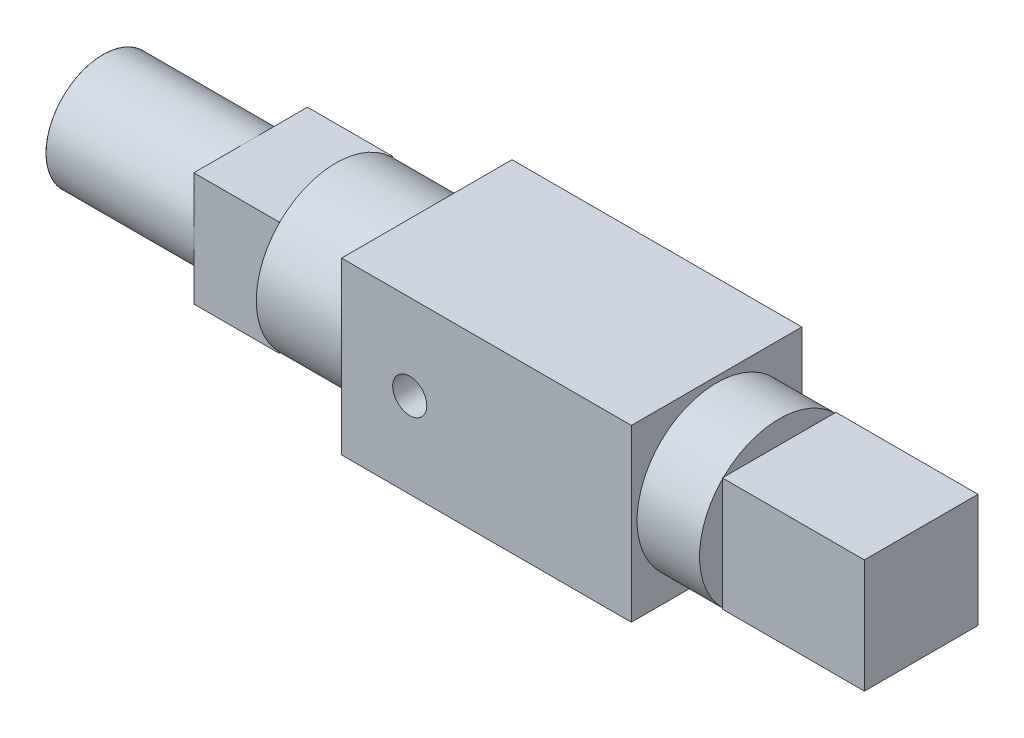
ISO-10303-21;
HEADER;
FILE_DESCRIPTION(('STEP AP214'),'2;1');
FILE_NAME('part.step','',(''),(''),'','','');
FILE_SCHEMA(('AUTOMOTIVE_DESIGN { 1 0 10303 214 1 1 1 1 }'));
ENDSEC;
DATA;
#1=APPLICATION_CONTEXT('core data for automotive mechanical design processes');
#2=APPLICATION_PROTOCOL_DEFINITION('international standard','automotive_design',2000,#1);
#3=PRODUCT_CONTEXT('',#1,'mechanical');
#4=PRODUCT('Part','Part','',(#3));
#5=PRODUCT_RELATED_PRODUCT_CATEGORY('part','',(#4));
#6=PRODUCT_DEFINITION_FORMATION('','',#4);
#7=PRODUCT_DEFINITION_CONTEXT('part definition',#1,'design');
#8=PRODUCT_DEFINITION('design','',#6,#7);
#9=PRODUCT_DEFINITION_SHAPE('','',#8);
#10=(LENGTH_UNIT() NAMED_UNIT(*) SI_UNIT(.MILLI.,.METRE.));
#11=(NAMED_UNIT(*) PLANE_ANGLE_UNIT() SI_UNIT($,.RADIAN.));
#12=(NAMED_UNIT(*) SI_UNIT($,.STERADIAN.) SOLID_ANGLE_UNIT());
#13=UNCERTAINTY_MEASURE_WITH_UNIT(LENGTH_MEASURE(1.E-05),#10,'distance_accuracy_value','');
#14=(GEOMETRIC_REPRESENTATION_CONTEXT(3) GLOBAL_UNCERTAINTY_ASSIGNED_CONTEXT((#13)) GLOBAL_UNIT_ASSIGNED_CONTEXT((#10,
#11,#12)) REPRESENTATION_CONTEXT('',''));
#15=CARTESIAN_POINT('',(0.,0.,0.));
#16=DIRECTION('',(0.,0.,1.));
#17=DIRECTION('',(1.,0.,0.));
#18=AXIS2_PLACEMENT_3D('',#15,#16,#17);
#19=CARTESIAN_POINT('',(72.,-7.49999999999999,-7.50000000000002));
#20=DIRECTION('',(0.,0.,1.00000000000001));
#21=DIRECTION('',(1.,0.,0.));
#22=AXIS2_PLACEMENT_3D('',#19,#20,#21);
#23=PLANE('',#22);
#24=CARTESIAN_POINT('',(34.5,0.,-7.49999999999999));
#25=DIRECTION('',(0.,0.,1.00000000000001));
#26=DIRECTION('',(1.,0.,0.));
#27=AXIS2_PLACEMENT_3D('',#24,#25,#26);
#28=CIRCLE('',#27,1.5);
#29=CARTESIAN_POINT('',(36.,0.,-7.49999999999999));
#30=VERTEX_POINT('',#29);
#31=EDGE_CURVE('E396',#30,#30,#28,.T.);
#32=ORIENTED_EDGE('',*,*,#31,.T.);
#33=EDGE_LOOP('',(#32));
#34=FACE_BOUND('',#33,.T.);
#35=DIRECTION('',(0.,1.00000000000001,0.));
#36=VECTOR('',#35,1.);
#37=CARTESIAN_POINT('',(54.,-7.49999999999999,-7.50000000000001));
#38=LINE('',#37,#36);
#39=CARTESIAN_POINT('',(54.,-7.49999999999999,-7.50000000000001));
#40=VERTEX_POINT('',#39);
#41=CARTESIAN_POINT('',(54.,7.50000000000002,-7.50000000000006));
#42=VERTEX_POINT('',#41);
#43=EDGE_CURVE('E191',#40,#42,#38,.T.);
#44=ORIENTED_EDGE('',*,*,#43,.F.);
#45=DIRECTION('',(-1.,0.,0.));
#46=VECTOR('',#45,1.);
#47=CARTESIAN_POINT('',(72.,-7.49999999999999,-7.50000000000002));
#48=LINE('',#47,#46);
#49=CARTESIAN_POINT('',(28.5,-7.49999999999999,-7.50000000000001));
#50=VERTEX_POINT('',#49);
#51=EDGE_CURVE('E201',#40,#50,#48,.T.);
#52=ORIENTED_EDGE('',*,*,#51,.T.);
#53=DIRECTION('',(0.,-1.00000000000001,0.));
#54=VECTOR('',#53,1.);
#55=CARTESIAN_POINT('',(28.5,7.50000000000001,-7.50000000000001));
#56=LINE('',#55,#54);
#57=CARTESIAN_POINT('',(28.5,7.50000000000001,-7.50000000000001));
#58=VERTEX_POINT('',#57);
#59=EDGE_CURVE('E240',#58,#50,#56,.T.);
#60=ORIENTED_EDGE('',*,*,#59,.F.);
#61=DIRECTION('',(-1.,0.,0.));
#62=VECTOR('',#61,1.);
#63=CARTESIAN_POINT('',(72.,7.50000000000002,-7.50000000000006));
#64=LINE('',#63,#62);
#65=EDGE_CURVE('E11',#42,#58,#64,.T.);
#66=ORIENTED_EDGE('',*,*,#65,.F.);
#67=EDGE_LOOP('',(#44,#52,#60,#66));
#68=FACE_BOUND('',#67,.T.);
#69=ADVANCED_FACE('F43',(#34,#68),#23,.F.);
#70=CARTESIAN_POINT('',(72.,7.50000000000001,7.49999999999999));
#71=DIRECTION('',(0.,-1.00000000000001,0.));
#72=DIRECTION('',(0.,0.,-1.00000000000001));
#73=AXIS2_PLACEMENT_3D('',#70,#71,#72);
#74=PLANE('',#73);
#75=DIRECTION('',(0.,0.,1.00000000000001));
#76=VECTOR('',#75,1.);
#77=CARTESIAN_POINT('',(54.,7.50000000000002,-7.50000000000006));
#78=LINE('',#77,#76);
#79=CARTESIAN_POINT('',(54.,7.50000000000001,7.49999999999999));
#80=VERTEX_POINT('',#79);
#81=EDGE_CURVE('E204',#42,#80,#78,.T.);
#82=ORIENTED_EDGE('',*,*,#81,.F.);
#83=ORIENTED_EDGE('',*,*,#65,.T.);
#84=DIRECTION('',(0.,0.,-1.00000000000001));
#85=VECTOR('',#84,1.);
#86=CARTESIAN_POINT('',(28.5,7.50000000000001,7.5));
#87=LINE('',#86,#85);
#88=CARTESIAN_POINT('',(28.5,7.50000000000001,7.5));
#89=VERTEX_POINT('',#88);
#90=EDGE_CURVE('E235',#89,#58,#87,.T.);
#91=ORIENTED_EDGE('',*,*,#90,.F.);
#92=DIRECTION('',(-1.,0.,0.));
#93=VECTOR('',#92,1.);
#94=CARTESIAN_POINT('',(72.,7.50000000000001,7.49999999999999));
#95=LINE('',#94,#93);
#96=EDGE_CURVE('E51',#80,#89,#95,.T.);
#97=ORIENTED_EDGE('',*,*,#96,.F.);
#98=EDGE_LOOP('',(#82,#83,#91,#97));
#99=FACE_BOUND('',#98,.T.);
#100=ADVANCED_FACE('F238',(#99),#74,.F.);
#101=CARTESIAN_POINT('',(72.,-7.49999999999997,7.50000000000003));
#102=DIRECTION('',(0.,0.,-1.00000000000001));
#103=DIRECTION('',(-1.,0.,0.));
#104=AXIS2_PLACEMENT_3D('',#101,#102,#103);
#105=PLANE('',#104);
#106=CARTESIAN_POINT('',(34.5,0.,7.50000000000011));
#107=DIRECTION('',(0.,0.,1.00000000000001));
#108=DIRECTION('',(1.,0.,0.));
#109=AXIS2_PLACEMENT_3D('',#106,#107,#108);
#110=CIRCLE('',#109,1.5);
#111=CARTESIAN_POINT('',(36.,0.,7.50000000000011));
#112=VERTEX_POINT('',#111);
#113=EDGE_CURVE('E400',#112,#112,#110,.T.);
#114=ORIENTED_EDGE('',*,*,#113,.F.);
#115=EDGE_LOOP('',(#114));
#116=FACE_BOUND('',#115,.T.);
#117=DIRECTION('',(0.,-1.00000000000001,0.));
#118=VECTOR('',#117,1.);
#119=CARTESIAN_POINT('',(54.,7.50000000000001,7.49999999999999));
#120=LINE('',#119,#118);
#121=CARTESIAN_POINT('',(54.,-7.49999999999999,7.5));
#122=VERTEX_POINT('',#121);
#123=EDGE_CURVE('E58',#80,#122,#120,.T.);
#124=ORIENTED_EDGE('',*,*,#123,.F.);
#125=ORIENTED_EDGE('',*,*,#96,.T.);
#126=DIRECTION('',(0.,1.00000000000001,0.));
#127=VECTOR('',#126,1.);
#128=CARTESIAN_POINT('',(28.5,-7.49999999999999,7.5));
#129=LINE('',#128,#127);
#130=CARTESIAN_POINT('',(28.5,-7.49999999999999,7.5));
#131=VERTEX_POINT('',#130);
#132=EDGE_CURVE('E229',#131,#89,#129,.T.);
#133=ORIENTED_EDGE('',*,*,#132,.F.);
#134=DIRECTION('',(-1.,0.,0.));
#135=VECTOR('',#134,1.);
#136=CARTESIAN_POINT('',(72.,-7.49999999999997,7.50000000000003));
#137=LINE('',#136,#135);
#138=EDGE_CURVE('E211',#122,#131,#137,.T.);
#139=ORIENTED_EDGE('',*,*,#138,.F.);
#140=EDGE_LOOP('',(#124,#125,#133,#139));
#141=FACE_BOUND('',#140,.T.);
#142=ADVANCED_FACE('F228',(#116,#141),#105,.F.);
#143=CARTESIAN_POINT('',(72.,-7.49999999999997,7.50000000000003));
#144=DIRECTION('',(0.,1.00000000000001,0.));
#145=DIRECTION('',(0.,0.,1.00000000000001));
#146=AXIS2_PLACEMENT_3D('',#143,#144,#145);
#147=PLANE('',#146);
#148=DIRECTION('',(0.,0.,-1.00000000000001));
#149=VECTOR('',#148,1.);
#150=CARTESIAN_POINT('',(54.,-7.49999999999999,7.5));
#151=LINE('',#150,#149);
#152=EDGE_CURVE('E188',#122,#40,#151,.T.);
#153=ORIENTED_EDGE('',*,*,#152,.F.);
#154=ORIENTED_EDGE('',*,*,#138,.T.);
#155=DIRECTION('',(0.,0.,1.00000000000001));
#156=VECTOR('',#155,1.);
#157=CARTESIAN_POINT('',(28.5,-7.49999999999999,-7.50000000000001));
#158=LINE('',#157,#156);
#159=EDGE_CURVE('E209',#50,#131,#158,.T.);
#160=ORIENTED_EDGE('',*,*,#159,.F.);
#161=ORIENTED_EDGE('',*,*,#51,.F.);
#162=EDGE_LOOP('',(#153,#154,#160,#161));
#163=FACE_BOUND('',#162,.T.);
#164=ADVANCED_FACE('F207',(#163),#147,.F.);
#165=CARTESIAN_POINT('',(20.5,0.,0.));
#166=DIRECTION('',(-1.,0.,0.));
#167=DIRECTION('',(0.,0.,1.00000000000001));
#168=AXIS2_PLACEMENT_3D('',#165,#166,#167);
#169=PLANE('',#168);
#170=DIRECTION('',(0.,0.,-1.00000000000001));
#171=VECTOR('',#170,1.);
#172=CARTESIAN_POINT('',(20.5,5.00000000000005,-5.00000000000001));
#173=LINE('',#172,#171);
#174=CARTESIAN_POINT('',(20.5,5.,4.89897948556636));
#175=VERTEX_POINT('',#174);
#176=CARTESIAN_POINT('',(20.5,5.,-4.89897948556637));
#177=VERTEX_POINT('',#176);
#178=EDGE_CURVE('E263',#175,#177,#173,.T.);
#179=ORIENTED_EDGE('',*,*,#178,.F.);
#180=CARTESIAN_POINT('',(20.5,0.,0.));
#181=DIRECTION('',(-1.,0.,0.));
#182=DIRECTION('',(0.,0.,1.00000000000001));
#183=AXIS2_PLACEMENT_3D('',#180,#181,#182);
#184=CIRCLE('',#183,7.);
#185=EDGE_CURVE('E366',#175,#177,#184,.T.);
#186=ORIENTED_EDGE('',*,*,#185,.T.);
#187=EDGE_LOOP('',(#179,#186));
#188=FACE_BOUND('',#187,.T.);
#189=ADVANCED_FACE('F550',(#188),#169,.T.);
#190=DIRECTION('',(0.,-1.00000000000001,0.));
#191=VECTOR('',#190,1.);
#192=CARTESIAN_POINT('',(20.5,-4.99999999999999,-5.00000000000003));
#193=LINE('',#192,#191);
#194=CARTESIAN_POINT('',(20.5,4.89897948556635,-5.));
#195=VERTEX_POINT('',#194);
#196=CARTESIAN_POINT('',(20.5,-4.89897948556629,-4.99999999999998));
#197=VERTEX_POINT('',#196);
#198=EDGE_CURVE('E269',#195,#197,#193,.T.);
#199=ORIENTED_EDGE('',*,*,#198,.F.);
#200=EDGE_CURVE('E359',#195,#197,#184,.T.);
#201=ORIENTED_EDGE('',*,*,#200,.T.);
#202=EDGE_LOOP('',(#199,#201));
#203=FACE_BOUND('',#202,.T.);
#204=ADVANCED_FACE('F568',(#203),#169,.T.);
#205=DIRECTION('',(0.,0.,1.00000000000001));
#206=VECTOR('',#205,1.);
#207=CARTESIAN_POINT('',(20.5,-4.99999999999999,-5.00000000000003));
#208=LINE('',#207,#206);
#209=CARTESIAN_POINT('',(20.5,-4.99999999999996,-4.89897948556636));
#210=VERTEX_POINT('',#209);
#211=CARTESIAN_POINT('',(20.5,-5.,4.89897948556637));
#212=VERTEX_POINT('',#211);
#213=EDGE_CURVE('E274',#210,#212,#208,.T.);
#214=ORIENTED_EDGE('',*,*,#213,.F.);
#215=EDGE_CURVE('E348',#210,#212,#184,.T.);
#216=ORIENTED_EDGE('',*,*,#215,.T.);
#217=EDGE_LOOP('',(#214,#216));
#218=FACE_BOUND('',#217,.T.);
#219=ADVANCED_FACE('F347',(#218),#169,.T.);
#220=DIRECTION('',(0.,1.00000000000001,0.));
#221=VECTOR('',#220,1.);
#222=CARTESIAN_POINT('',(20.5,-4.99999999999996,5.00000000000004));
#223=LINE('',#222,#221);
#224=CARTESIAN_POINT('',(20.5,-4.89897948556636,4.99999999999999));
#225=VERTEX_POINT('',#224);
#226=CARTESIAN_POINT('',(20.5,4.89897948556642,5.00000000000002));
#227=VERTEX_POINT('',#226);
#228=EDGE_CURVE('E264',#225,#227,#223,.T.);
#229=ORIENTED_EDGE('',*,*,#228,.F.);
#230=EDGE_CURVE('E361',#225,#227,#184,.T.);
#231=ORIENTED_EDGE('',*,*,#230,.T.);
#232=EDGE_LOOP('',(#229,#231));
#233=FACE_BOUND('',#232,.T.);
#234=ADVANCED_FACE('F487',(#233),#169,.T.);
#235=CARTESIAN_POINT('',(13.,0.,0.));
#236=DIRECTION('',(-1.,0.,0.));
#237=DIRECTION('',(0.,0.,1.00000000000001));
#238=AXIS2_PLACEMENT_3D('',#235,#236,#237);
#239=PLANE('',#238);
#240=DIRECTION('',(0.,-1.00000000000001,0.));
#241=VECTOR('',#240,1.);
#242=CARTESIAN_POINT('',(13.,-4.99999999999991,-5.00000000000012));
#243=LINE('',#242,#241);
#244=CARTESIAN_POINT('',(13.,0.,-5.));
#245=VERTEX_POINT('',#244);
#246=CARTESIAN_POINT('',(13.,-4.99999999999991,-5.00000000000012));
#247=VERTEX_POINT('',#246);
#248=EDGE_CURVE('E289',#245,#247,#243,.T.);
#249=ORIENTED_EDGE('',*,*,#248,.T.);
#250=DIRECTION('',(0.,0.,1.00000000000001));
#251=VECTOR('',#250,1.);
#252=CARTESIAN_POINT('',(13.,-4.99999999999991,-5.00000000000012));
#253=LINE('',#252,#251);
#254=CARTESIAN_POINT('',(13.,-5.00000000000002,0.));
#255=VERTEX_POINT('',#254);
#256=EDGE_CURVE('E295',#247,#255,#253,.T.);
#257=ORIENTED_EDGE('',*,*,#256,.T.);
#258=CARTESIAN_POINT('',(13.,0.,0.));
#259=DIRECTION('',(-1.,0.,0.));
#260=DIRECTION('',(0.,0.,1.00000000000001));
#261=AXIS2_PLACEMENT_3D('',#258,#259,#260);
#262=CIRCLE('',#261,5.);
#263=EDGE_CURVE('E805',#245,#255,#262,.T.);
#264=ORIENTED_EDGE('',*,*,#263,.F.);
#265=EDGE_LOOP('',(#249,#257,#264));
#266=FACE_BOUND('',#265,.T.);
#267=ADVANCED_FACE('F556',(#266),#239,.T.);
#268=CARTESIAN_POINT('',(13.,0.,5.));
#269=VERTEX_POINT('',#268);
#270=EDGE_CURVE('E220',#255,#269,#262,.T.);
#271=ORIENTED_EDGE('',*,*,#270,.F.);
#272=CARTESIAN_POINT('',(13.,-4.99999999999999,5.));
#273=VERTEX_POINT('',#272);
#274=EDGE_CURVE('E294',#255,#273,#253,.T.);
#275=ORIENTED_EDGE('',*,*,#274,.T.);
#276=DIRECTION('',(0.,1.00000000000001,0.));
#277=VECTOR('',#276,1.);
#278=CARTESIAN_POINT('',(13.,-4.99999999999999,5.));
#279=LINE('',#278,#277);
#280=EDGE_CURVE('E280',#273,#269,#279,.T.);
#281=ORIENTED_EDGE('',*,*,#280,.T.);
#282=EDGE_LOOP('',(#271,#275,#281));
#283=FACE_BOUND('',#282,.T.);
#284=ADVANCED_FACE('F559',(#283),#239,.T.);
#285=CARTESIAN_POINT('',(13.,5.00000000000005,0.));
#286=VERTEX_POINT('',#285);
#287=EDGE_CURVE('E212',#269,#286,#262,.T.);
#288=ORIENTED_EDGE('',*,*,#287,.F.);
#289=CARTESIAN_POINT('',(13.,4.99999999999999,5.00000000000001));
#290=VERTEX_POINT('',#289);
#291=EDGE_CURVE('E258',#269,#290,#279,.T.);
#292=ORIENTED_EDGE('',*,*,#291,.T.);
#293=DIRECTION('',(0.,0.,-1.00000000000001));
#294=VECTOR('',#293,1.);
#295=CARTESIAN_POINT('',(13.0000000000002,5.00000000000003,-5.));
#296=LINE('',#295,#294);
#297=EDGE_CURVE('E285',#290,#286,#296,.T.);
#298=ORIENTED_EDGE('',*,*,#297,.T.);
#299=EDGE_LOOP('',(#288,#292,#298));
#300=FACE_BOUND('',#299,.T.);
#301=ADVANCED_FACE('F324',(#300),#239,.T.);
#302=CARTESIAN_POINT('',(13.0000000000002,5.00000000000003,-5.));
#303=VERTEX_POINT('',#302);
#304=EDGE_CURVE('E284',#286,#303,#296,.T.);
#305=ORIENTED_EDGE('',*,*,#304,.T.);
#306=EDGE_CURVE('E290',#303,#245,#243,.T.);
#307=ORIENTED_EDGE('',*,*,#306,.T.);
#308=EDGE_CURVE('E218',#286,#245,#262,.T.);
#309=ORIENTED_EDGE('',*,*,#308,.F.);
#310=EDGE_LOOP('',(#305,#307,#309));
#311=FACE_BOUND('',#310,.T.);
#312=ADVANCED_FACE('F561',(#311),#239,.T.);
#313=CARTESIAN_POINT('',(13.,0.,0.));
#314=DIRECTION('',(-1.,0.,0.));
#315=DIRECTION('',(0.,0.,1.00000000000001));
#316=AXIS2_PLACEMENT_3D('',#313,#314,#315);
#317=CYLINDRICAL_SURFACE('',#316,5.);
#318=ORIENTED_EDGE('',*,*,#287,.T.);
#319=ORIENTED_EDGE('',*,*,#308,.T.);
#320=ORIENTED_EDGE('',*,*,#263,.T.);
#321=ORIENTED_EDGE('',*,*,#270,.T.);
#322=EDGE_LOOP('',(#318,#319,#320,#321));
#323=FACE_BOUND('',#322,.T.);
#324=CARTESIAN_POINT('',(0.,0.,0.));
#325=DIRECTION('',(-1.,0.,0.));
#326=DIRECTION('',(0.,0.,1.00000000000001));
#327=AXIS2_PLACEMENT_3D('',#324,#325,#326);
#328=CIRCLE('',#327,5.);
#329=CARTESIAN_POINT('',(0.,0.,5.00000000000003));
#330=VERTEX_POINT('',#329);
#331=EDGE_CURVE('E222',#330,#330,#328,.T.);
#332=ORIENTED_EDGE('',*,*,#331,.F.);
#333=EDGE_LOOP('',(#332));
#334=FACE_BOUND('',#333,.T.);
#335=ADVANCED_FACE('F562',(#323,#334),#317,.T.);
#336=CARTESIAN_POINT('',(20.5,-4.99999999999996,5.00000000000004));
#337=DIRECTION('',(0.,0.,1.00000000000001));
#338=DIRECTION('',(1.,0.,0.));
#339=AXIS2_PLACEMENT_3D('',#336,#337,#338);
#340=PLANE('',#339);
#341=ORIENTED_EDGE('',*,*,#280,.F.);
#342=DIRECTION('',(-1.,0.,0.));
#343=VECTOR('',#342,1.);
#344=CARTESIAN_POINT('',(20.5,-4.99999999999996,5.00000000000004));
#345=LINE('',#344,#343);
#346=CARTESIAN_POINT('',(20.5,-4.99999999999996,5.00000000000004));
#347=VERTEX_POINT('',#346);
#348=EDGE_CURVE('E299',#347,#273,#345,.T.);
#349=ORIENTED_EDGE('',*,*,#348,.F.);
#350=EDGE_CURVE('E259',#347,#225,#223,.T.);
#351=ORIENTED_EDGE('',*,*,#350,.T.);
#352=ORIENTED_EDGE('',*,*,#228,.T.);
#353=DIRECTION('',(0.,-1.00000000000001,0.));
#354=VECTOR('',#353,1.);
#355=CARTESIAN_POINT('',(20.5,-4.99999999999996,5.00000000000004));
#356=LINE('',#355,#354);
#357=CARTESIAN_POINT('',(20.5,5.,5.00000000000002));
#358=VERTEX_POINT('',#357);
#359=EDGE_CURVE('E243',#358,#227,#356,.T.);
#360=ORIENTED_EDGE('',*,*,#359,.F.);
#361=DIRECTION('',(-1.,0.,0.));
#362=VECTOR('',#361,1.);
#363=CARTESIAN_POINT('',(20.5,5.,5.00000000000002));
#364=LINE('',#363,#362);
#365=EDGE_CURVE('E279',#358,#290,#364,.T.);
#366=ORIENTED_EDGE('',*,*,#365,.T.);
#367=ORIENTED_EDGE('',*,*,#291,.F.);
#368=EDGE_LOOP('',(#341,#349,#351,#352,#360,#366,#367));
#369=FACE_BOUND('',#368,.T.);
#370=ADVANCED_FACE('F315',(#369),#340,.T.);
#371=CARTESIAN_POINT('',(20.5,-4.99999999999999,-5.00000000000003));
#372=DIRECTION('',(0.,-1.00000000000001,0.));
#373=DIRECTION('',(0.,0.,-1.00000000000001));
#374=AXIS2_PLACEMENT_3D('',#371,#372,#373);
#375=PLANE('',#374);
#376=ORIENTED_EDGE('',*,*,#256,.F.);
#377=DIRECTION('',(-1.,0.,0.));
#378=VECTOR('',#377,1.);
#379=CARTESIAN_POINT('',(20.5,-4.99999999999999,-5.00000000000003));
#380=LINE('',#379,#378);
#381=CARTESIAN_POINT('',(20.5,-4.99999999999999,-5.00000000000003));
#382=VERTEX_POINT('',#381);
#383=EDGE_CURVE('E302',#382,#247,#380,.T.);
#384=ORIENTED_EDGE('',*,*,#383,.F.);
#385=EDGE_CURVE('E275',#382,#210,#208,.T.);
#386=ORIENTED_EDGE('',*,*,#385,.T.);
#387=ORIENTED_EDGE('',*,*,#213,.T.);
#388=DIRECTION('',(0.,0.,-1.00000000000001));
#389=VECTOR('',#388,1.);
#390=CARTESIAN_POINT('',(20.5,-4.99999999999999,-5.00000000000003));
#391=LINE('',#390,#389);
#392=EDGE_CURVE('E255',#347,#212,#391,.T.);
#393=ORIENTED_EDGE('',*,*,#392,.F.);
#394=ORIENTED_EDGE('',*,*,#348,.T.);
#395=ORIENTED_EDGE('',*,*,#274,.F.);
#396=EDGE_LOOP('',(#376,#384,#386,#387,#393,#394,#395));
#397=FACE_BOUND('',#396,.T.);
#398=ADVANCED_FACE('F342',(#397),#375,.T.);
#399=CARTESIAN_POINT('',(20.5,-4.99999999999999,-5.00000000000003));
#400=DIRECTION('',(0.,0.,-1.00000000000001));
#401=DIRECTION('',(-1.,0.,0.));
#402=AXIS2_PLACEMENT_3D('',#399,#400,#401);
#403=PLANE('',#402);
#404=ORIENTED_EDGE('',*,*,#306,.F.);
#405=DIRECTION('',(-1.,0.,0.));
#406=VECTOR('',#405,1.);
#407=CARTESIAN_POINT('',(20.5,5.00000000000005,-5.00000000000001));
#408=LINE('',#407,#406);
#409=CARTESIAN_POINT('',(20.5,5.00000000000005,-5.00000000000001));
#410=VERTEX_POINT('',#409);
#411=EDGE_CURVE('E305',#410,#303,#408,.T.);
#412=ORIENTED_EDGE('',*,*,#411,.F.);
#413=EDGE_CURVE('E270',#410,#195,#193,.T.);
#414=ORIENTED_EDGE('',*,*,#413,.T.);
#415=ORIENTED_EDGE('',*,*,#198,.T.);
#416=DIRECTION('',(0.,1.00000000000001,0.));
#417=VECTOR('',#416,1.);
#418=CARTESIAN_POINT('',(20.5,-4.99999999999999,-5.00000000000003));
#419=LINE('',#418,#417);
#420=EDGE_CURVE('E250',#382,#197,#419,.T.);
#421=ORIENTED_EDGE('',*,*,#420,.F.);
#422=ORIENTED_EDGE('',*,*,#383,.T.);
#423=ORIENTED_EDGE('',*,*,#248,.F.);
#424=EDGE_LOOP('',(#404,#412,#414,#415,#421,#422,#423));
#425=FACE_BOUND('',#424,.T.);
#426=ADVANCED_FACE('F574',(#425),#403,.T.);
#427=CARTESIAN_POINT('',(20.5,5.00000000000005,-5.00000000000001));
#428=DIRECTION('',(0.,1.00000000000001,0.));
#429=DIRECTION('',(0.,0.,1.00000000000001));
#430=AXIS2_PLACEMENT_3D('',#427,#428,#429);
#431=PLANE('',#430);
#432=ORIENTED_EDGE('',*,*,#297,.F.);
#433=ORIENTED_EDGE('',*,*,#365,.F.);
#434=EDGE_CURVE('E265',#358,#175,#173,.T.);
#435=ORIENTED_EDGE('',*,*,#434,.T.);
#436=ORIENTED_EDGE('',*,*,#178,.T.);
#437=DIRECTION('',(0.,0.,1.00000000000001));
#438=VECTOR('',#437,1.);
#439=CARTESIAN_POINT('',(20.5,5.00000000000005,-5.00000000000001));
#440=LINE('',#439,#438);
#441=EDGE_CURVE('E247',#410,#177,#440,.T.);
#442=ORIENTED_EDGE('',*,*,#441,.F.);
#443=ORIENTED_EDGE('',*,*,#411,.T.);
#444=ORIENTED_EDGE('',*,*,#304,.F.);
#445=EDGE_LOOP('',(#432,#433,#435,#436,#442,#443,#444));
#446=FACE_BOUND('',#445,.T.);
#447=ADVANCED_FACE('F319',(#446),#431,.T.);
#448=CARTESIAN_POINT('',(20.5,0.,0.));
#449=DIRECTION('',(-1.,0.,0.));
#450=DIRECTION('',(0.,0.,1.00000000000001));
#451=AXIS2_PLACEMENT_3D('',#448,#449,#450);
#452=PLANE('',#451);
#453=ORIENTED_EDGE('',*,*,#350,.F.);
#454=ORIENTED_EDGE('',*,*,#392,.T.);
#455=EDGE_CURVE('E355',#212,#225,#184,.T.);
#456=ORIENTED_EDGE('',*,*,#455,.T.);
#457=EDGE_LOOP('',(#453,#454,#456));
#458=FACE_BOUND('',#457,.T.);
#459=ADVANCED_FACE('F385',(#458),#452,.F.);
#460=ORIENTED_EDGE('',*,*,#385,.F.);
#461=ORIENTED_EDGE('',*,*,#420,.T.);
#462=EDGE_CURVE('E354',#197,#210,#184,.T.);
#463=ORIENTED_EDGE('',*,*,#462,.T.);
#464=EDGE_LOOP('',(#460,#461,#463));
#465=FACE_BOUND('',#464,.T.);
#466=ADVANCED_FACE('F386',(#465),#452,.F.);
#467=ORIENTED_EDGE('',*,*,#413,.F.);
#468=ORIENTED_EDGE('',*,*,#441,.T.);
#469=EDGE_CURVE('E821',#177,#195,#184,.T.);
#470=ORIENTED_EDGE('',*,*,#469,.T.);
#471=EDGE_LOOP('',(#467,#468,#470));
#472=FACE_BOUND('',#471,.T.);
#473=ADVANCED_FACE('F377',(#472),#452,.F.);
#474=CARTESIAN_POINT('',(28.5,0.,0.));
#475=DIRECTION('',(-1.,0.,0.));
#476=DIRECTION('',(0.,0.,1.00000000000001));
#477=AXIS2_PLACEMENT_3D('',#474,#475,#476);
#478=PLANE('',#477);
#479=CARTESIAN_POINT('',(28.5,0.,0.));
#480=DIRECTION('',(-1.,0.,0.));
#481=DIRECTION('',(0.,0.,1.00000000000001));
#482=AXIS2_PLACEMENT_3D('',#479,#480,#481);
#483=CIRCLE('',#482,7.);
#484=CARTESIAN_POINT('',(28.5,0.,7.00000000000004));
#485=VERTEX_POINT('',#484);
#486=EDGE_CURVE('E365',#485,#485,#483,.T.);
#487=ORIENTED_EDGE('',*,*,#486,.F.);
#488=EDGE_LOOP('',(#487));
#489=FACE_BOUND('',#488,.T.);
#490=ORIENTED_EDGE('',*,*,#159,.T.);
#491=ORIENTED_EDGE('',*,*,#132,.T.);
#492=ORIENTED_EDGE('',*,*,#90,.T.);
#493=ORIENTED_EDGE('',*,*,#59,.T.);
#494=EDGE_LOOP('',(#490,#491,#492,#493));
#495=FACE_BOUND('',#494,.T.);
#496=ADVANCED_FACE('F234',(#489,#495),#478,.T.);
#497=ORIENTED_EDGE('',*,*,#359,.T.);
#498=EDGE_CURVE('E362',#227,#175,#184,.T.);
#499=ORIENTED_EDGE('',*,*,#498,.T.);
#500=ORIENTED_EDGE('',*,*,#434,.F.);
#501=EDGE_LOOP('',(#497,#499,#500));
#502=FACE_BOUND('',#501,.T.);
#503=ADVANCED_FACE('F376',(#502),#452,.F.);
#504=CARTESIAN_POINT('',(28.5,0.,0.));
#505=DIRECTION('',(-1.,0.,0.));
#506=DIRECTION('',(0.,0.,1.00000000000001));
#507=AXIS2_PLACEMENT_3D('',#504,#505,#506);
#508=CYLINDRICAL_SURFACE('',#507,7.);
#509=ORIENTED_EDGE('',*,*,#486,.T.);
#510=EDGE_LOOP('',(#509));
#511=FACE_BOUND('',#510,.T.);
#512=ORIENTED_EDGE('',*,*,#498,.F.);
#513=ORIENTED_EDGE('',*,*,#230,.F.);
#514=ORIENTED_EDGE('',*,*,#455,.F.);
#515=ORIENTED_EDGE('',*,*,#215,.F.);
#516=ORIENTED_EDGE('',*,*,#462,.F.);
#517=ORIENTED_EDGE('',*,*,#200,.F.);
#518=ORIENTED_EDGE('',*,*,#469,.F.);
#519=ORIENTED_EDGE('',*,*,#185,.F.);
#520=EDGE_LOOP('',(#512,#513,#514,#515,#516,#517,#518,#519));
#521=FACE_BOUND('',#520,.T.);
#522=ADVANCED_FACE('F373',(#511,#521),#508,.T.);
#523=CARTESIAN_POINT('',(0.,0.,0.));
#524=DIRECTION('',(-1.,0.,0.));
#525=DIRECTION('',(0.,-1.00000000000001,0.));
#526=AXIS2_PLACEMENT_3D('',#523,#524,#525);
#527=PLANE('',#526);
#528=ORIENTED_EDGE('',*,*,#331,.T.);
#529=EDGE_LOOP('',(#528));
#530=FACE_BOUND('',#529,.T.);
#531=CARTESIAN_POINT('',(0.,0.,0.));
#532=DIRECTION('',(1.,0.,0.));
#533=DIRECTION('',(0.,1.00000000000001,0.));
#534=AXIS2_PLACEMENT_3D('',#531,#532,#533);
#535=CIRCLE('',#534,5.00899191454728);
#536=CARTESIAN_POINT('',(0.,5.0089919145473,0.));
#537=VERTEX_POINT('',#536);
#538=EDGE_CURVE('E470',#537,#537,#535,.T.);
#539=ORIENTED_EDGE('',*,*,#538,.T.);
#540=EDGE_LOOP('',(#539));
#541=FACE_BOUND('',#540,.T.);
#542=ADVANCED_FACE('F492',(#530,#541),#527,.F.);
#543=CARTESIAN_POINT('',(9.00000000000021,0.,0.));
#544=DIRECTION('',(1.,0.,0.));
#545=DIRECTION('',(0.,1.00000000000001,0.));
#546=AXIS2_PLACEMENT_3D('',#543,#544,#545);
#547=SPHERICAL_SURFACE('',#546,10.3);
#548=ORIENTED_EDGE('',*,*,#538,.F.);
#549=EDGE_LOOP('',(#548));
#550=FACE_BOUND('',#549,.T.);
#551=ADVANCED_FACE('F496',(#550),#547,.T.);
#552=CARTESIAN_POINT('',(59.5,0.,1.04083408558608E-13));
#553=DIRECTION('',(1.,0.,0.));
#554=DIRECTION('',(0.,0.,-1.00000000000001));
#555=AXIS2_PLACEMENT_3D('',#552,#553,#554);
#556=PLANE('',#555);
#557=DIRECTION('',(0.,1.00000000000001,0.));
#558=VECTOR('',#557,1.);
#559=CARTESIAN_POINT('',(59.5,-4.99999999999999,-4.99999999999996));
#560=LINE('',#559,#558);
#561=CARTESIAN_POINT('',(59.5,-4.99999999999999,-4.99999999999996));
#562=VERTEX_POINT('',#561);
#563=CARTESIAN_POINT('',(59.5,-4.89897948556636,-5.00000000000002));
#564=VERTEX_POINT('',#563);
#565=EDGE_CURVE('E430',#562,#564,#560,.T.);
#566=ORIENTED_EDGE('',*,*,#565,.F.);
#567=DIRECTION('',(0.,0.,1.00000000000001));
#568=VECTOR('',#567,1.);
#569=CARTESIAN_POINT('',(59.5,-4.99999999999998,5.00000000000002));
#570=LINE('',#569,#568);
#571=CARTESIAN_POINT('',(59.5,-4.99999999999999,-4.89897948556636));
#572=VERTEX_POINT('',#571);
#573=EDGE_CURVE('E426',#562,#572,#570,.T.);
#574=ORIENTED_EDGE('',*,*,#573,.T.);
#575=CARTESIAN_POINT('',(59.5,0.,1.04083408558608E-13));
#576=DIRECTION('',(1.,0.,0.));
#577=DIRECTION('',(0.,0.,-1.00000000000001));
#578=AXIS2_PLACEMENT_3D('',#575,#576,#577);
#579=CIRCLE('',#578,7.);
#580=EDGE_CURVE('E405',#572,#564,#579,.T.);
#581=ORIENTED_EDGE('',*,*,#580,.T.);
#582=EDGE_LOOP('',(#566,#574,#581));
#583=FACE_BOUND('',#582,.T.);
#584=ADVANCED_FACE('F502',(#583),#556,.F.);
#585=DIRECTION('',(0.,0.,-1.00000000000001));
#586=VECTOR('',#585,1.);
#587=CARTESIAN_POINT('',(59.5,-4.99999999999998,5.00000000000002));
#588=LINE('',#587,#586);
#589=CARTESIAN_POINT('',(59.5,-4.99999999999998,5.00000000000002));
#590=VERTEX_POINT('',#589);
#591=CARTESIAN_POINT('',(59.5,-4.99999999999999,4.89897948556636));
#592=VERTEX_POINT('',#591);
#593=EDGE_CURVE('E447',#590,#592,#588,.T.);
#594=ORIENTED_EDGE('',*,*,#593,.F.);
#595=DIRECTION('',(0.,1.00000000000001,0.));
#596=VECTOR('',#595,1.);
#597=CARTESIAN_POINT('',(59.5,-4.99999999999998,5.00000000000002));
#598=LINE('',#597,#596);
#599=CARTESIAN_POINT('',(59.5,-4.89897948556642,5.00000000000016));
#600=VERTEX_POINT('',#599);
#601=EDGE_CURVE('E423',#590,#600,#598,.T.);
#602=ORIENTED_EDGE('',*,*,#601,.T.);
#603=EDGE_CURVE('E752',#600,#592,#579,.T.);
#604=ORIENTED_EDGE('',*,*,#603,.T.);
#605=EDGE_LOOP('',(#594,#602,#604));
#606=FACE_BOUND('',#605,.T.);
#607=ADVANCED_FACE('F686',(#606),#556,.F.);
#608=DIRECTION('',(0.,-1.00000000000001,0.));
#609=VECTOR('',#608,1.);
#610=CARTESIAN_POINT('',(59.5,-4.99999999999998,5.00000000000002));
#611=LINE('',#610,#609);
#612=CARTESIAN_POINT('',(59.5,5.,5.00000000000001));
#613=VERTEX_POINT('',#612);
#614=CARTESIAN_POINT('',(59.5,4.89897948556642,5.00000000000002));
#615=VERTEX_POINT('',#614);
#616=EDGE_CURVE('E442',#613,#615,#611,.T.);
#617=ORIENTED_EDGE('',*,*,#616,.F.);
#618=DIRECTION('',(0.,0.,1.00000000000001));
#619=VECTOR('',#618,1.);
#620=CARTESIAN_POINT('',(59.5,5.,5.00000000000001));
#621=LINE('',#620,#619);
#622=CARTESIAN_POINT('',(59.5,4.99999999999999,4.89897948556637));
#623=VERTEX_POINT('',#622);
#624=EDGE_CURVE('E434',#623,#613,#621,.T.);
#625=ORIENTED_EDGE('',*,*,#624,.F.);
#626=EDGE_CURVE('E717',#623,#615,#579,.T.);
#627=ORIENTED_EDGE('',*,*,#626,.T.);
#628=EDGE_LOOP('',(#617,#625,#627));
#629=FACE_BOUND('',#628,.T.);
#630=ADVANCED_FACE('F532',(#629),#556,.F.);
#631=CARTESIAN_POINT('',(54.,0.,0.));
#632=DIRECTION('',(1.,0.,0.));
#633=DIRECTION('',(0.,0.,-1.00000000000001));
#634=AXIS2_PLACEMENT_3D('',#631,#632,#633);
#635=PLANE('',#634);
#636=CARTESIAN_POINT('',(54.,0.,0.));
#637=DIRECTION('',(1.,0.,0.));
#638=DIRECTION('',(0.,0.,-1.00000000000001));
#639=AXIS2_PLACEMENT_3D('',#636,#637,#638);
#640=CIRCLE('',#639,7.);
#641=CARTESIAN_POINT('',(54.,0.,-7.00000000000004));
#642=VERTEX_POINT('',#641);
#643=EDGE_CURVE('E410',#642,#642,#640,.T.);
#644=ORIENTED_EDGE('',*,*,#643,.F.);
#645=EDGE_LOOP('',(#644));
#646=FACE_BOUND('',#645,.T.);
#647=ORIENTED_EDGE('',*,*,#123,.T.);
#648=ORIENTED_EDGE('',*,*,#152,.T.);
#649=ORIENTED_EDGE('',*,*,#43,.T.);
#650=ORIENTED_EDGE('',*,*,#81,.T.);
#651=EDGE_LOOP('',(#647,#648,#649,#650));
#652=FACE_BOUND('',#651,.T.);
#653=ADVANCED_FACE('F190',(#646,#652),#635,.T.);
#654=DIRECTION('',(0.,-1.00000000000001,0.));
#655=VECTOR('',#654,1.);
#656=CARTESIAN_POINT('',(59.5,-4.99999999999999,-4.99999999999996));
#657=LINE('',#656,#655);
#658=CARTESIAN_POINT('',(59.5,5.00000000000005,-5.00000000000004));
#659=VERTEX_POINT('',#658);
#660=CARTESIAN_POINT('',(59.5,4.89897948556646,-5.00000000000002));
#661=VERTEX_POINT('',#660);
#662=EDGE_CURVE('E420',#659,#661,#657,.T.);
#663=ORIENTED_EDGE('',*,*,#662,.T.);
#664=CARTESIAN_POINT('',(59.5,5.00000000000012,-4.89897948556644));
#665=VERTEX_POINT('',#664);
#666=EDGE_CURVE('E66',#661,#665,#579,.T.);
#667=ORIENTED_EDGE('',*,*,#666,.T.);
#668=EDGE_CURVE('E436',#659,#665,#621,.T.);
#669=ORIENTED_EDGE('',*,*,#668,.F.);
#670=EDGE_LOOP('',(#663,#667,#669));
#671=FACE_BOUND('',#670,.T.);
#672=ADVANCED_FACE('F528',(#671),#556,.F.);
#673=CARTESIAN_POINT('',(54.,0.,0.));
#674=DIRECTION('',(1.,0.,0.));
#675=DIRECTION('',(0.,0.,-1.00000000000001));
#676=AXIS2_PLACEMENT_3D('',#673,#674,#675);
#677=CYLINDRICAL_SURFACE('',#676,7.);
#678=ORIENTED_EDGE('',*,*,#643,.T.);
#679=EDGE_LOOP('',(#678));
#680=FACE_BOUND('',#679,.T.);
#681=ORIENTED_EDGE('',*,*,#666,.F.);
#682=EDGE_CURVE('E399',#564,#661,#579,.T.);
#683=ORIENTED_EDGE('',*,*,#682,.F.);
#684=ORIENTED_EDGE('',*,*,#580,.F.);
#685=EDGE_CURVE('E755',#592,#572,#579,.T.);
#686=ORIENTED_EDGE('',*,*,#685,.F.);
#687=ORIENTED_EDGE('',*,*,#603,.F.);
#688=EDGE_CURVE('E749',#615,#600,#579,.T.);
#689=ORIENTED_EDGE('',*,*,#688,.F.);
#690=ORIENTED_EDGE('',*,*,#626,.F.);
#691=EDGE_CURVE('E415',#665,#623,#579,.T.);
#692=ORIENTED_EDGE('',*,*,#691,.F.);
#693=EDGE_LOOP('',(#681,#683,#684,#686,#687,#689,#690,#692));
#694=FACE_BOUND('',#693,.T.);
#695=ADVANCED_FACE('F531',(#680,#694),#677,.T.);
#696=CARTESIAN_POINT('',(72.,0.,0.));
#697=DIRECTION('',(-1.,0.,0.));
#698=DIRECTION('',(0.,0.,1.00000000000001));
#699=AXIS2_PLACEMENT_3D('',#696,#697,#698);
#700=PLANE('',#699);
#701=DIRECTION('',(0.,1.00000000000001,0.));
#702=VECTOR('',#701,1.);
#703=CARTESIAN_POINT('',(72.,-4.99999999999999,-4.99999999999998));
#704=LINE('',#703,#702);
#705=CARTESIAN_POINT('',(72.,-4.99999999999999,-4.99999999999998));
#706=VERTEX_POINT('',#705);
#707=CARTESIAN_POINT('',(72.,5.00000000000005,-5.00000000000004));
#708=VERTEX_POINT('',#707);
#709=EDGE_CURVE('E429',#706,#708,#704,.T.);
#710=ORIENTED_EDGE('',*,*,#709,.T.);
#711=DIRECTION('',(0.,0.,1.00000000000001));
#712=VECTOR('',#711,1.);
#713=CARTESIAN_POINT('',(72.,4.99999999999998,4.99999999999999));
#714=LINE('',#713,#712);
#715=CARTESIAN_POINT('',(72.,4.99999999999998,4.99999999999999));
#716=VERTEX_POINT('',#715);
#717=EDGE_CURVE('E455',#708,#716,#714,.T.);
#718=ORIENTED_EDGE('',*,*,#717,.T.);
#719=DIRECTION('',(0.,-1.00000000000001,0.));
#720=VECTOR('',#719,1.);
#721=CARTESIAN_POINT('',(72.,-4.99999999999996,5.00000000000003));
#722=LINE('',#721,#720);
#723=CARTESIAN_POINT('',(72.,-4.99999999999996,5.00000000000003));
#724=VERTEX_POINT('',#723);
#725=EDGE_CURVE('E459',#716,#724,#722,.T.);
#726=ORIENTED_EDGE('',*,*,#725,.T.);
#727=DIRECTION('',(0.,0.,-1.00000000000001));
#728=VECTOR('',#727,1.);
#729=CARTESIAN_POINT('',(72.,-4.99999999999996,5.00000000000003));
#730=LINE('',#729,#728);
#731=EDGE_CURVE('E463',#724,#706,#730,.T.);
#732=ORIENTED_EDGE('',*,*,#731,.T.);
#733=EDGE_LOOP('',(#710,#718,#726,#732));
#734=FACE_BOUND('',#733,.T.);
#735=ADVANCED_FACE('F520',(#734),#700,.F.);
#736=CARTESIAN_POINT('',(59.5,5.,5.00000000000001));
#737=DIRECTION('',(0.,1.00000000000001,0.));
#738=DIRECTION('',(0.,0.,1.00000000000001));
#739=AXIS2_PLACEMENT_3D('',#736,#737,#738);
#740=PLANE('',#739);
#741=ORIENTED_EDGE('',*,*,#717,.F.);
#742=DIRECTION('',(1.,0.,0.));
#743=VECTOR('',#742,1.);
#744=CARTESIAN_POINT('',(59.5,5.00000000000005,-5.00000000000004));
#745=LINE('',#744,#743);
#746=EDGE_CURVE('E451',#659,#708,#745,.T.);
#747=ORIENTED_EDGE('',*,*,#746,.F.);
#748=ORIENTED_EDGE('',*,*,#668,.T.);
#749=EDGE_CURVE('E441',#665,#623,#621,.T.);
#750=ORIENTED_EDGE('',*,*,#749,.T.);
#751=ORIENTED_EDGE('',*,*,#624,.T.);
#752=DIRECTION('',(1.,0.,0.));
#753=VECTOR('',#752,1.);
#754=CARTESIAN_POINT('',(59.5,5.,5.00000000000001));
#755=LINE('',#754,#753);
#756=EDGE_CURVE('E474',#613,#716,#755,.T.);
#757=ORIENTED_EDGE('',*,*,#756,.T.);
#758=EDGE_LOOP('',(#741,#747,#748,#750,#751,#757));
#759=FACE_BOUND('',#758,.T.);
#760=ADVANCED_FACE('F516',(#759),#740,.T.);
#761=CARTESIAN_POINT('',(59.5,-4.99999999999998,5.00000000000002));
#762=DIRECTION('',(0.,0.,1.00000000000001));
#763=DIRECTION('',(1.,0.,0.));
#764=AXIS2_PLACEMENT_3D('',#761,#762,#763);
#765=PLANE('',#764);
#766=ORIENTED_EDGE('',*,*,#725,.F.);
#767=ORIENTED_EDGE('',*,*,#756,.F.);
#768=ORIENTED_EDGE('',*,*,#616,.T.);
#769=EDGE_CURVE('E440',#615,#600,#611,.T.);
#770=ORIENTED_EDGE('',*,*,#769,.T.);
#771=ORIENTED_EDGE('',*,*,#601,.F.);
#772=DIRECTION('',(1.,0.,0.));
#773=VECTOR('',#772,1.);
#774=CARTESIAN_POINT('',(59.5,-4.99999999999998,5.00000000000002));
#775=LINE('',#774,#773);
#776=EDGE_CURVE('E471',#590,#724,#775,.T.);
#777=ORIENTED_EDGE('',*,*,#776,.T.);
#778=EDGE_LOOP('',(#766,#767,#768,#770,#771,#777));
#779=FACE_BOUND('',#778,.T.);
#780=ADVANCED_FACE('F519',(#779),#765,.T.);
#781=CARTESIAN_POINT('',(59.5,-4.99999999999998,5.00000000000002));
#782=DIRECTION('',(0.,-1.00000000000001,0.));
#783=DIRECTION('',(0.,0.,-1.00000000000001));
#784=AXIS2_PLACEMENT_3D('',#781,#782,#783);
#785=PLANE('',#784);
#786=ORIENTED_EDGE('',*,*,#731,.F.);
#787=ORIENTED_EDGE('',*,*,#776,.F.);
#788=ORIENTED_EDGE('',*,*,#593,.T.);
#789=EDGE_CURVE('E446',#592,#572,#588,.T.);
#790=ORIENTED_EDGE('',*,*,#789,.T.);
#791=ORIENTED_EDGE('',*,*,#573,.F.);
#792=DIRECTION('',(1.,0.,0.));
#793=VECTOR('',#792,1.);
#794=CARTESIAN_POINT('',(59.5,-4.99999999999999,-4.99999999999996));
#795=LINE('',#794,#793);
#796=EDGE_CURVE('E467',#562,#706,#795,.T.);
#797=ORIENTED_EDGE('',*,*,#796,.T.);
#798=EDGE_LOOP('',(#786,#787,#788,#790,#791,#797));
#799=FACE_BOUND('',#798,.T.);
#800=ADVANCED_FACE('F514',(#799),#785,.T.);
#801=CARTESIAN_POINT('',(59.5,-4.99999999999999,-4.99999999999996));
#802=DIRECTION('',(0.,0.,-1.00000000000001));
#803=DIRECTION('',(-1.,0.,0.));
#804=AXIS2_PLACEMENT_3D('',#801,#802,#803);
#805=PLANE('',#804);
#806=ORIENTED_EDGE('',*,*,#709,.F.);
#807=ORIENTED_EDGE('',*,*,#796,.F.);
#808=ORIENTED_EDGE('',*,*,#565,.T.);
#809=EDGE_CURVE('E435',#564,#661,#560,.T.);
#810=ORIENTED_EDGE('',*,*,#809,.T.);
#811=ORIENTED_EDGE('',*,*,#662,.F.);
#812=ORIENTED_EDGE('',*,*,#746,.T.);
#813=EDGE_LOOP('',(#806,#807,#808,#810,#811,#812));
#814=FACE_BOUND('',#813,.T.);
#815=ADVANCED_FACE('F511',(#814),#805,.T.);
#816=CARTESIAN_POINT('',(59.5,0.,1.04083408558608E-13));
#817=DIRECTION('',(1.,0.,0.));
#818=DIRECTION('',(0.,0.,-1.00000000000001));
#819=AXIS2_PLACEMENT_3D('',#816,#817,#818);
#820=PLANE('',#819);
#821=ORIENTED_EDGE('',*,*,#809,.F.);
#822=ORIENTED_EDGE('',*,*,#682,.T.);
#823=EDGE_LOOP('',(#821,#822));
#824=FACE_BOUND('',#823,.T.);
#825=ADVANCED_FACE('F510',(#824),#820,.T.);
#826=ORIENTED_EDGE('',*,*,#789,.F.);
#827=ORIENTED_EDGE('',*,*,#685,.T.);
#828=EDGE_LOOP('',(#826,#827));
#829=FACE_BOUND('',#828,.T.);
#830=ADVANCED_FACE('F652',(#829),#820,.T.);
#831=ORIENTED_EDGE('',*,*,#769,.F.);
#832=ORIENTED_EDGE('',*,*,#688,.T.);
#833=EDGE_LOOP('',(#831,#832));
#834=FACE_BOUND('',#833,.T.);
#835=ADVANCED_FACE('F508',(#834),#820,.T.);
#836=ORIENTED_EDGE('',*,*,#749,.F.);
#837=ORIENTED_EDGE('',*,*,#691,.T.);
#838=EDGE_LOOP('',(#836,#837));
#839=FACE_BOUND('',#838,.T.);
#840=ADVANCED_FACE('F504',(#839),#820,.T.);
#841=CARTESIAN_POINT('',(34.5,0.,-7.49999999999999));
#842=DIRECTION('',(0.,0.,1.00000000000001));
#843=DIRECTION('',(1.,0.,0.));
#844=AXIS2_PLACEMENT_3D('',#841,#842,#843);
#845=CYLINDRICAL_SURFACE('',#844,1.5);
#846=ORIENTED_EDGE('',*,*,#31,.F.);
#847=EDGE_LOOP('',(#846));
#848=FACE_BOUND('',#847,.T.);
#849=ORIENTED_EDGE('',*,*,#113,.T.);
#850=EDGE_LOOP('',(#849));
#851=FACE_BOUND('',#850,.T.);
#852=ADVANCED_FACE('F507',(#848,#851),#845,.F.);
#853=CLOSED_SHELL('',(#69,#100,#142,#164,#189,#204,#219,#234,#267,#284,#301,#312,#335,#370,#398,
#426,#447,#459,#466,#473,#496,#503,#522,#542,#551,#584,#607,#630,#653,#672,#695,#735,#760,#780,
#800,#815,#825,#830,#835,#840,#852));
#854=MANIFOLD_SOLID_BREP('B2',#853);
#855=ADVANCED_BREP_SHAPE_REPRESENTATION('',(#18,#854),#14);
#856=SHAPE_DEFINITION_REPRESENTATION(#9,#855);
ENDSEC;
END-ISO-10303-21;
